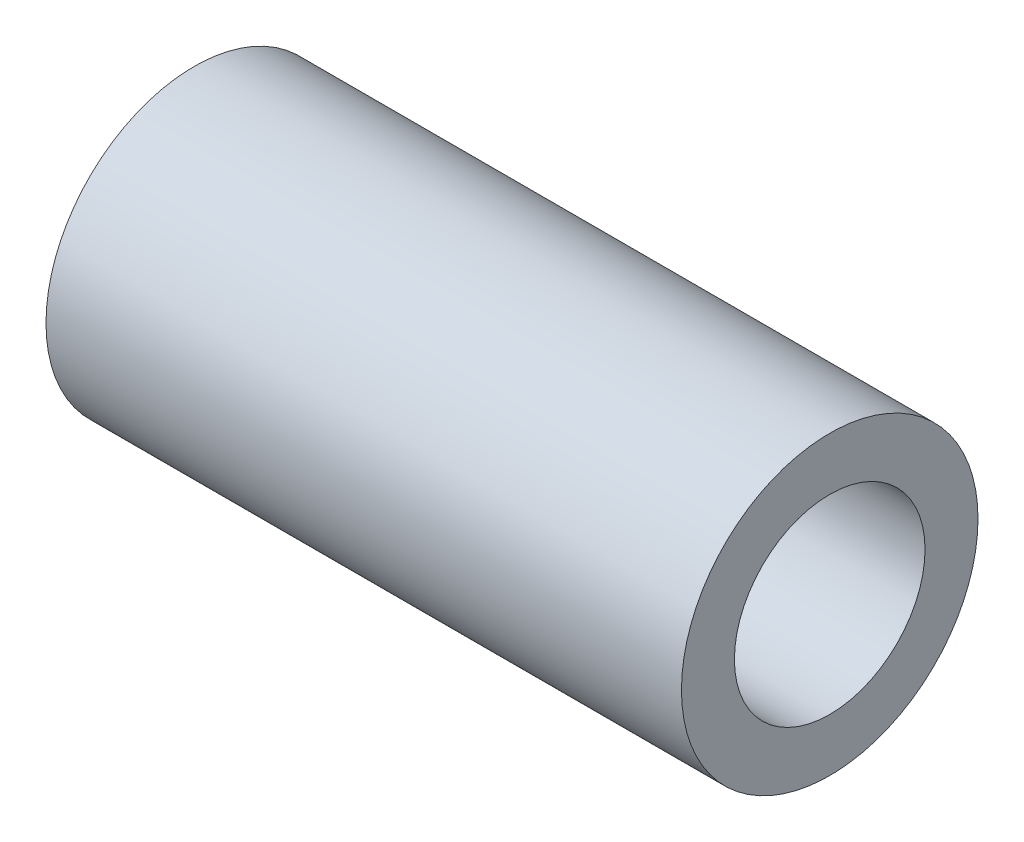
ISO-10303-21;
HEADER;
FILE_DESCRIPTION(('STEP AP214'),'2;1');
FILE_NAME('part.step','',(''),(''),'','','');
FILE_SCHEMA(('AUTOMOTIVE_DESIGN { 1 0 10303 214 1 1 1 1 }'));
ENDSEC;
DATA;
#1=APPLICATION_CONTEXT('core data for automotive mechanical design processes');
#2=APPLICATION_PROTOCOL_DEFINITION('international standard','automotive_design',2000,#1);
#3=PRODUCT_CONTEXT('',#1,'mechanical');
#4=PRODUCT('Part','Part','',(#3));
#5=PRODUCT_RELATED_PRODUCT_CATEGORY('part','',(#4));
#6=PRODUCT_DEFINITION_FORMATION('','',#4);
#7=PRODUCT_DEFINITION_CONTEXT('part definition',#1,'design');
#8=PRODUCT_DEFINITION('design','',#6,#7);
#9=PRODUCT_DEFINITION_SHAPE('','',#8);
#10=(LENGTH_UNIT() NAMED_UNIT(*) SI_UNIT(.MILLI.,.METRE.));
#11=(NAMED_UNIT(*) PLANE_ANGLE_UNIT() SI_UNIT($,.RADIAN.));
#12=(NAMED_UNIT(*) SI_UNIT($,.STERADIAN.) SOLID_ANGLE_UNIT());
#13=UNCERTAINTY_MEASURE_WITH_UNIT(LENGTH_MEASURE(1.E-05),#10,'distance_accuracy_value','');
#14=(GEOMETRIC_REPRESENTATION_CONTEXT(3) GLOBAL_UNCERTAINTY_ASSIGNED_CONTEXT((#13)) GLOBAL_UNIT_ASSIGNED_CONTEXT((#10,
#11,#12)) REPRESENTATION_CONTEXT('',''));
#15=CARTESIAN_POINT('',(0.,0.,0.));
#16=DIRECTION('',(0.,0.,1.));
#17=DIRECTION('',(1.,0.,0.));
#18=AXIS2_PLACEMENT_3D('',#15,#16,#17);
#19=CARTESIAN_POINT('',(-1.52399999999997,0.,0.));
#20=DIRECTION('',(1.,0.,0.));
#21=DIRECTION('',(0.,0.,-1.));
#22=AXIS2_PLACEMENT_3D('',#19,#20,#21);
#23=CYLINDRICAL_SURFACE('',#22,0.228599999999995);
#24=CARTESIAN_POINT('',(0.,0.,0.));
#25=DIRECTION('',(1.,0.,0.));
#26=DIRECTION('',(0.,0.,-1.));
#27=AXIS2_PLACEMENT_3D('',#24,#25,#26);
#28=CIRCLE('',#27,0.228599999999995);
#29=CARTESIAN_POINT('',(0.,0.,-0.228599999999995));
#30=VERTEX_POINT('',#29);
#31=EDGE_CURVE('E10',#30,#30,#28,.T.);
#32=ORIENTED_EDGE('',*,*,#31,.T.);
#33=EDGE_LOOP('',(#32));
#34=FACE_BOUND('',#33,.T.);
#35=CARTESIAN_POINT('',(-1.52399999999997,0.,0.));
#36=DIRECTION('',(1.,0.,0.));
#37=DIRECTION('',(0.,0.,-1.));
#38=AXIS2_PLACEMENT_3D('',#35,#36,#37);
#39=CIRCLE('',#38,0.228599999999995);
#40=CARTESIAN_POINT('',(-1.52399999999997,0.,-0.228599999999995));
#41=VERTEX_POINT('',#40);
#42=EDGE_CURVE('E62',#41,#41,#39,.T.);
#43=ORIENTED_EDGE('',*,*,#42,.F.);
#44=EDGE_LOOP('',(#43));
#45=FACE_BOUND('',#44,.T.);
#46=ADVANCED_FACE('F43',(#34,#45),#23,.F.);
#47=CARTESIAN_POINT('',(0.,0.228599999999995,0.));
#48=DIRECTION('',(1.,0.,0.));
#49=DIRECTION('',(0.,0.,-1.));
#50=AXIS2_PLACEMENT_3D('',#47,#48,#49);
#51=PLANE('',#50);
#52=CARTESIAN_POINT('',(0.,0.,0.));
#53=DIRECTION('',(1.,0.,0.));
#54=DIRECTION('',(0.,0.,-1.));
#55=AXIS2_PLACEMENT_3D('',#52,#53,#54);
#56=CIRCLE('',#55,0.355599999999998);
#57=CARTESIAN_POINT('',(0.,0.,-0.355599999999998));
#58=VERTEX_POINT('',#57);
#59=EDGE_CURVE('E50',#58,#58,#56,.T.);
#60=ORIENTED_EDGE('',*,*,#59,.T.);
#61=EDGE_LOOP('',(#60));
#62=FACE_BOUND('',#61,.T.);
#63=ORIENTED_EDGE('',*,*,#31,.F.);
#64=EDGE_LOOP('',(#63));
#65=FACE_BOUND('',#64,.T.);
#66=ADVANCED_FACE('F74',(#62,#65),#51,.T.);
#67=CARTESIAN_POINT('',(-1.52399999999997,0.,0.));
#68=DIRECTION('',(1.,0.,0.));
#69=DIRECTION('',(0.,0.,-1.));
#70=AXIS2_PLACEMENT_3D('',#67,#68,#69);
#71=CYLINDRICAL_SURFACE('',#70,0.355599999999998);
#72=CARTESIAN_POINT('',(-1.52399999999997,0.,0.));
#73=DIRECTION('',(1.,0.,0.));
#74=DIRECTION('',(0.,0.,-1.));
#75=AXIS2_PLACEMENT_3D('',#72,#73,#74);
#76=CIRCLE('',#75,0.355599999999997);
#77=CARTESIAN_POINT('',(-1.52399999999997,0.,-0.355599999999997));
#78=VERTEX_POINT('',#77);
#79=EDGE_CURVE('E56',#78,#78,#76,.T.);
#80=ORIENTED_EDGE('',*,*,#79,.T.);
#81=EDGE_LOOP('',(#80));
#82=FACE_BOUND('',#81,.T.);
#83=ORIENTED_EDGE('',*,*,#59,.F.);
#84=EDGE_LOOP('',(#83));
#85=FACE_BOUND('',#84,.T.);
#86=ADVANCED_FACE('F78',(#82,#85),#71,.T.);
#87=CARTESIAN_POINT('',(-1.52399999999996,0.355600000000011,0.));
#88=DIRECTION('',(-1.,0.,0.));
#89=DIRECTION('',(0.,0.,1.));
#90=AXIS2_PLACEMENT_3D('',#87,#88,#89);
#91=PLANE('',#90);
#92=ORIENTED_EDGE('',*,*,#42,.T.);
#93=EDGE_LOOP('',(#92));
#94=FACE_BOUND('',#93,.T.);
#95=ORIENTED_EDGE('',*,*,#79,.F.);
#96=EDGE_LOOP('',(#95));
#97=FACE_BOUND('',#96,.T.);
#98=ADVANCED_FACE('F70',(#94,#97),#91,.T.);
#99=CLOSED_SHELL('',(#46,#66,#86,#98));
#100=MANIFOLD_SOLID_BREP('B2',#99);
#101=ADVANCED_BREP_SHAPE_REPRESENTATION('',(#18,#100),#14);
#102=SHAPE_DEFINITION_REPRESENTATION(#9,#101);
ENDSEC;
END-ISO-10303-21;
